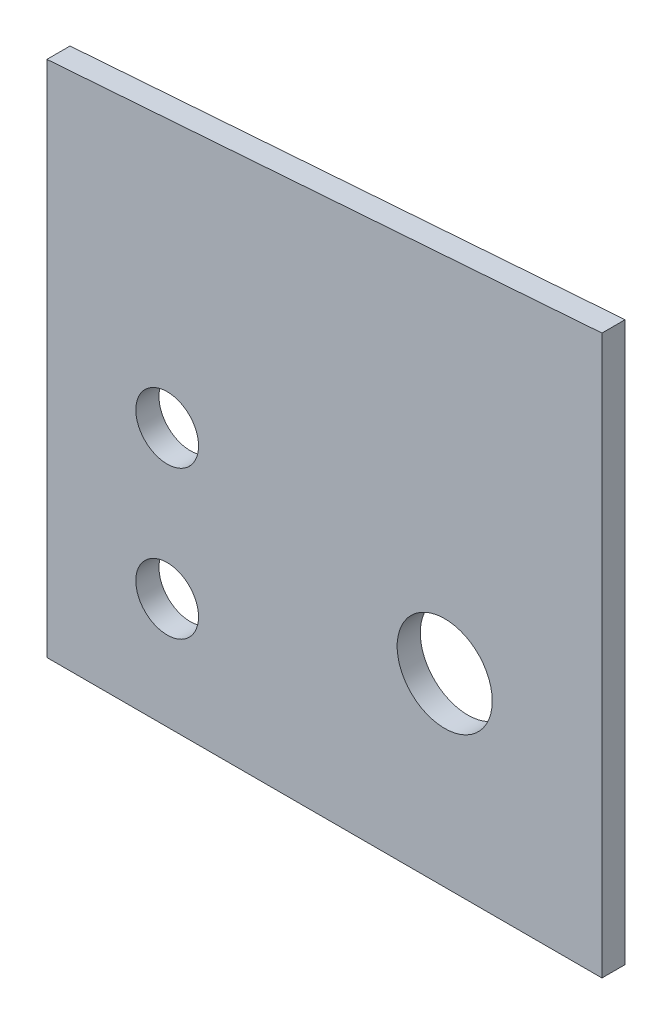
ISO-10303-21;
HEADER;
FILE_DESCRIPTION(('STEP AP214'),'2;1');
FILE_NAME('part.step','',(''),(''),'','','');
FILE_SCHEMA(('AUTOMOTIVE_DESIGN { 1 0 10303 214 1 1 1 1 }'));
ENDSEC;
DATA;
#1=APPLICATION_CONTEXT('core data for automotive mechanical design processes');
#2=APPLICATION_PROTOCOL_DEFINITION('international standard','automotive_design',2000,#1);
#3=PRODUCT_CONTEXT('',#1,'mechanical');
#4=PRODUCT('Part','Part','',(#3));
#5=PRODUCT_RELATED_PRODUCT_CATEGORY('part','',(#4));
#6=PRODUCT_DEFINITION_FORMATION('','',#4);
#7=PRODUCT_DEFINITION_CONTEXT('part definition',#1,'design');
#8=PRODUCT_DEFINITION('design','',#6,#7);
#9=PRODUCT_DEFINITION_SHAPE('','',#8);
#10=(LENGTH_UNIT() NAMED_UNIT(*) SI_UNIT(.MILLI.,.METRE.));
#11=(NAMED_UNIT(*) PLANE_ANGLE_UNIT() SI_UNIT($,.RADIAN.));
#12=(NAMED_UNIT(*) SI_UNIT($,.STERADIAN.) SOLID_ANGLE_UNIT());
#13=UNCERTAINTY_MEASURE_WITH_UNIT(LENGTH_MEASURE(1.E-05),#10,'distance_accuracy_value','');
#14=(GEOMETRIC_REPRESENTATION_CONTEXT(3) GLOBAL_UNCERTAINTY_ASSIGNED_CONTEXT((#13)) GLOBAL_UNIT_ASSIGNED_CONTEXT((#10,
#11,#12)) REPRESENTATION_CONTEXT('',''));
#15=CARTESIAN_POINT('',(0.,0.,0.));
#16=DIRECTION('',(0.,0.,1.));
#17=DIRECTION('',(1.,0.,0.));
#18=AXIS2_PLACEMENT_3D('',#15,#16,#17);
#19=CARTESIAN_POINT('',(0.,0.,1.5875));
#20=DIRECTION('',(0.,1.,0.));
#21=DIRECTION('',(0.,0.,1.));
#22=AXIS2_PLACEMENT_3D('',#19,#20,#21);
#23=PLANE('',#22);
#24=DIRECTION('',(1.,0.,0.));
#25=VECTOR('',#24,1.);
#26=CARTESIAN_POINT('',(0.,0.,0.));
#27=LINE('',#26,#25);
#28=CARTESIAN_POINT('',(0.,0.,0.));
#29=VERTEX_POINT('',#28);
#30=CARTESIAN_POINT('',(38.1,0.,0.));
#31=VERTEX_POINT('',#30);
#32=EDGE_CURVE('E117',#29,#31,#27,.T.);
#33=ORIENTED_EDGE('',*,*,#32,.T.);
#34=DIRECTION('',(0.,0.,-1.));
#35=VECTOR('',#34,1.);
#36=CARTESIAN_POINT('',(38.1,0.,1.5875));
#37=LINE('',#36,#35);
#38=CARTESIAN_POINT('',(38.1,0.,1.5875));
#39=VERTEX_POINT('',#38);
#40=EDGE_CURVE('E11',#39,#31,#37,.T.);
#41=ORIENTED_EDGE('',*,*,#40,.F.);
#42=DIRECTION('',(1.,0.,0.));
#43=VECTOR('',#42,1.);
#44=CARTESIAN_POINT('',(0.,0.,1.5875));
#45=LINE('',#44,#43);
#46=CARTESIAN_POINT('',(0.,0.,1.5875));
#47=VERTEX_POINT('',#46);
#48=EDGE_CURVE('E94',#47,#39,#45,.T.);
#49=ORIENTED_EDGE('',*,*,#48,.F.);
#50=DIRECTION('',(0.,0.,-1.));
#51=VECTOR('',#50,1.);
#52=CARTESIAN_POINT('',(0.,0.,1.5875));
#53=LINE('',#52,#51);
#54=EDGE_CURVE('E60',#47,#29,#53,.T.);
#55=ORIENTED_EDGE('',*,*,#54,.T.);
#56=EDGE_LOOP('',(#33,#41,#49,#55));
#57=FACE_BOUND('',#56,.T.);
#58=ADVANCED_FACE('F44',(#57),#23,.F.);
#59=CARTESIAN_POINT('',(38.1,0.,1.5875));
#60=DIRECTION('',(-1.,0.,0.));
#61=DIRECTION('',(0.,-1.,0.));
#62=AXIS2_PLACEMENT_3D('',#59,#60,#61);
#63=PLANE('',#62);
#64=DIRECTION('',(0.,1.,0.));
#65=VECTOR('',#64,1.);
#66=CARTESIAN_POINT('',(38.1,0.,0.));
#67=LINE('',#66,#65);
#68=CARTESIAN_POINT('',(38.1,38.3404376298724,0.));
#69=VERTEX_POINT('',#68);
#70=EDGE_CURVE('E99',#31,#69,#67,.T.);
#71=ORIENTED_EDGE('',*,*,#70,.T.);
#72=DIRECTION('',(0.,0.,-1.));
#73=VECTOR('',#72,1.);
#74=CARTESIAN_POINT('',(38.1,38.3404376298724,1.5875));
#75=LINE('',#74,#73);
#76=CARTESIAN_POINT('',(38.1,38.3404376298724,1.5875));
#77=VERTEX_POINT('',#76);
#78=EDGE_CURVE('E52',#77,#69,#75,.T.);
#79=ORIENTED_EDGE('',*,*,#78,.F.);
#80=DIRECTION('',(0.,1.,0.));
#81=VECTOR('',#80,1.);
#82=CARTESIAN_POINT('',(38.1,0.,1.5875));
#83=LINE('',#82,#81);
#84=EDGE_CURVE('E85',#39,#77,#83,.T.);
#85=ORIENTED_EDGE('',*,*,#84,.F.);
#86=ORIENTED_EDGE('',*,*,#40,.T.);
#87=EDGE_LOOP('',(#71,#79,#85,#86));
#88=FACE_BOUND('',#87,.T.);
#89=ADVANCED_FACE('F98',(#88),#63,.F.);
#90=CARTESIAN_POINT('',(-2.58132775459605,35.3716215006847,1.5875));
#91=DIRECTION('',(-0.0727838107538647,0.997347741207722,0.));
#92=DIRECTION('',(-0.997347741207722,-0.0727838107538647,0.));
#93=AXIS2_PLACEMENT_3D('',#90,#91,#92);
#94=PLANE('',#93);
#95=DIRECTION('',(0.997347741207722,0.0727838107538647,0.));
#96=VECTOR('',#95,1.);
#97=CARTESIAN_POINT('',(-2.58132775459605,35.3716215006847,0.));
#98=LINE('',#97,#96);
#99=CARTESIAN_POINT('',(0.,35.56,0.));
#100=VERTEX_POINT('',#99);
#101=EDGE_CURVE('E120',#100,#69,#98,.T.);
#102=ORIENTED_EDGE('',*,*,#101,.F.);
#103=DIRECTION('',(0.,0.,-1.));
#104=VECTOR('',#103,1.);
#105=CARTESIAN_POINT('',(0.,35.56,1.5875));
#106=LINE('',#105,#104);
#107=CARTESIAN_POINT('',(0.,35.56,1.5875));
#108=VERTEX_POINT('',#107);
#109=EDGE_CURVE('E74',#108,#100,#106,.T.);
#110=ORIENTED_EDGE('',*,*,#109,.F.);
#111=DIRECTION('',(0.997347741207722,0.0727838107538647,0.));
#112=VECTOR('',#111,1.);
#113=CARTESIAN_POINT('',(-2.58132775459605,35.3716215006847,1.5875));
#114=LINE('',#113,#112);
#115=EDGE_CURVE('E93',#108,#77,#114,.T.);
#116=ORIENTED_EDGE('',*,*,#115,.T.);
#117=ORIENTED_EDGE('',*,*,#78,.T.);
#118=EDGE_LOOP('',(#102,#110,#116,#117));
#119=FACE_BOUND('',#118,.T.);
#120=ADVANCED_FACE('F102',(#119),#94,.T.);
#121=CARTESIAN_POINT('',(8.255,7.62,1.5875));
#122=DIRECTION('',(0.,0.,-1.));
#123=DIRECTION('',(-1.,0.,0.));
#124=AXIS2_PLACEMENT_3D('',#121,#122,#123);
#125=CYLINDRICAL_SURFACE('',#124,2.15265);
#126=CARTESIAN_POINT('',(8.255,7.62,1.5875));
#127=DIRECTION('',(0.,0.,1.));
#128=DIRECTION('',(1.,0.,0.));
#129=AXIS2_PLACEMENT_3D('',#126,#127,#128);
#130=CIRCLE('',#129,2.15265);
#131=CARTESIAN_POINT('',(10.40765,7.62,1.5875));
#132=VERTEX_POINT('',#131);
#133=EDGE_CURVE('E111',#132,#132,#130,.T.);
#134=ORIENTED_EDGE('',*,*,#133,.T.);
#135=EDGE_LOOP('',(#134));
#136=FACE_BOUND('',#135,.T.);
#137=CARTESIAN_POINT('',(8.255,7.62,0.));
#138=DIRECTION('',(0.,0.,1.));
#139=DIRECTION('',(1.,0.,0.));
#140=AXIS2_PLACEMENT_3D('',#137,#138,#139);
#141=CIRCLE('',#140,2.15265);
#142=CARTESIAN_POINT('',(10.40765,7.62,0.));
#143=VERTEX_POINT('',#142);
#144=EDGE_CURVE('E128',#143,#143,#141,.T.);
#145=ORIENTED_EDGE('',*,*,#144,.F.);
#146=EDGE_LOOP('',(#145));
#147=FACE_BOUND('',#146,.T.);
#148=ADVANCED_FACE('F164',(#136,#147),#125,.F.);
#149=CARTESIAN_POINT('',(27.305,12.7,1.5875));
#150=DIRECTION('',(0.,0.,-1.));
#151=DIRECTION('',(-1.,0.,0.));
#152=AXIS2_PLACEMENT_3D('',#149,#150,#151);
#153=CYLINDRICAL_SURFACE('',#152,3.2639);
#154=CARTESIAN_POINT('',(27.305,12.7,1.5875));
#155=DIRECTION('',(0.,0.,1.));
#156=DIRECTION('',(1.,0.,0.));
#157=AXIS2_PLACEMENT_3D('',#154,#155,#156);
#158=CIRCLE('',#157,3.2639);
#159=CARTESIAN_POINT('',(30.5689,12.7,1.5875));
#160=VERTEX_POINT('',#159);
#161=EDGE_CURVE('E105',#160,#160,#158,.T.);
#162=ORIENTED_EDGE('',*,*,#161,.T.);
#163=EDGE_LOOP('',(#162));
#164=FACE_BOUND('',#163,.T.);
#165=CARTESIAN_POINT('',(27.305,12.7,0.));
#166=DIRECTION('',(0.,0.,1.));
#167=DIRECTION('',(1.,0.,0.));
#168=AXIS2_PLACEMENT_3D('',#165,#166,#167);
#169=CIRCLE('',#168,3.2639);
#170=CARTESIAN_POINT('',(30.5689,12.7,0.));
#171=VERTEX_POINT('',#170);
#172=EDGE_CURVE('E125',#171,#171,#169,.T.);
#173=ORIENTED_EDGE('',*,*,#172,.F.);
#174=EDGE_LOOP('',(#173));
#175=FACE_BOUND('',#174,.T.);
#176=ADVANCED_FACE('F149',(#164,#175),#153,.F.);
#177=CARTESIAN_POINT('',(0.,0.,1.5875));
#178=DIRECTION('',(-1.,0.,0.));
#179=DIRECTION('',(0.,-1.,0.));
#180=AXIS2_PLACEMENT_3D('',#177,#178,#179);
#181=PLANE('',#180);
#182=DIRECTION('',(0.,1.,0.));
#183=VECTOR('',#182,1.);
#184=CARTESIAN_POINT('',(0.,0.,0.));
#185=LINE('',#184,#183);
#186=EDGE_CURVE('E122',#29,#100,#185,.T.);
#187=ORIENTED_EDGE('',*,*,#186,.F.);
#188=ORIENTED_EDGE('',*,*,#54,.F.);
#189=DIRECTION('',(0.,1.,0.));
#190=VECTOR('',#189,1.);
#191=CARTESIAN_POINT('',(0.,0.,1.5875));
#192=LINE('',#191,#190);
#193=EDGE_CURVE('E103',#47,#108,#192,.T.);
#194=ORIENTED_EDGE('',*,*,#193,.T.);
#195=ORIENTED_EDGE('',*,*,#109,.T.);
#196=EDGE_LOOP('',(#187,#188,#194,#195));
#197=FACE_BOUND('',#196,.T.);
#198=ADVANCED_FACE('F141',(#197),#181,.T.);
#199=CARTESIAN_POINT('',(8.255,17.78,1.5875));
#200=DIRECTION('',(0.,0.,-1.));
#201=DIRECTION('',(-1.,0.,0.));
#202=AXIS2_PLACEMENT_3D('',#199,#200,#201);
#203=CYLINDRICAL_SURFACE('',#202,2.15265);
#204=CARTESIAN_POINT('',(8.255,17.78,1.5875));
#205=DIRECTION('',(0.,0.,1.));
#206=DIRECTION('',(1.,0.,0.));
#207=AXIS2_PLACEMENT_3D('',#204,#205,#206);
#208=CIRCLE('',#207,2.15265);
#209=CARTESIAN_POINT('',(10.40765,17.78,1.5875));
#210=VERTEX_POINT('',#209);
#211=EDGE_CURVE('E114',#210,#210,#208,.T.);
#212=ORIENTED_EDGE('',*,*,#211,.T.);
#213=EDGE_LOOP('',(#212));
#214=FACE_BOUND('',#213,.T.);
#215=CARTESIAN_POINT('',(8.255,17.78,0.));
#216=DIRECTION('',(0.,0.,1.));
#217=DIRECTION('',(1.,0.,0.));
#218=AXIS2_PLACEMENT_3D('',#215,#216,#217);
#219=CIRCLE('',#218,2.15265);
#220=CARTESIAN_POINT('',(10.40765,17.78,0.));
#221=VERTEX_POINT('',#220);
#222=EDGE_CURVE('E131',#221,#221,#219,.T.);
#223=ORIENTED_EDGE('',*,*,#222,.F.);
#224=EDGE_LOOP('',(#223));
#225=FACE_BOUND('',#224,.T.);
#226=ADVANCED_FACE('F139',(#214,#225),#203,.F.);
#227=CARTESIAN_POINT('',(0.,0.,1.5875));
#228=DIRECTION('',(0.,0.,1.));
#229=DIRECTION('',(1.,0.,0.));
#230=AXIS2_PLACEMENT_3D('',#227,#228,#229);
#231=PLANE('',#230);
#232=ORIENTED_EDGE('',*,*,#48,.T.);
#233=ORIENTED_EDGE('',*,*,#84,.T.);
#234=ORIENTED_EDGE('',*,*,#115,.F.);
#235=ORIENTED_EDGE('',*,*,#193,.F.);
#236=EDGE_LOOP('',(#232,#233,#234,#235));
#237=FACE_BOUND('',#236,.T.);
#238=ORIENTED_EDGE('',*,*,#161,.F.);
#239=EDGE_LOOP('',(#238));
#240=FACE_BOUND('',#239,.T.);
#241=ORIENTED_EDGE('',*,*,#133,.F.);
#242=EDGE_LOOP('',(#241));
#243=FACE_BOUND('',#242,.T.);
#244=ORIENTED_EDGE('',*,*,#211,.F.);
#245=EDGE_LOOP('',(#244));
#246=FACE_BOUND('',#245,.T.);
#247=ADVANCED_FACE('F89',(#237,#240,#243,#246),#231,.T.);
#248=CARTESIAN_POINT('',(0.,0.,0.));
#249=DIRECTION('',(0.,0.,1.));
#250=DIRECTION('',(1.,0.,0.));
#251=AXIS2_PLACEMENT_3D('',#248,#249,#250);
#252=PLANE('',#251);
#253=ORIENTED_EDGE('',*,*,#32,.F.);
#254=ORIENTED_EDGE('',*,*,#186,.T.);
#255=ORIENTED_EDGE('',*,*,#101,.T.);
#256=ORIENTED_EDGE('',*,*,#70,.F.);
#257=EDGE_LOOP('',(#253,#254,#255,#256));
#258=FACE_BOUND('',#257,.T.);
#259=ORIENTED_EDGE('',*,*,#172,.T.);
#260=EDGE_LOOP('',(#259));
#261=FACE_BOUND('',#260,.T.);
#262=ORIENTED_EDGE('',*,*,#144,.T.);
#263=EDGE_LOOP('',(#262));
#264=FACE_BOUND('',#263,.T.);
#265=ORIENTED_EDGE('',*,*,#222,.T.);
#266=EDGE_LOOP('',(#265));
#267=FACE_BOUND('',#266,.T.);
#268=ADVANCED_FACE('F137',(#258,#261,#264,#267),#252,.F.);
#269=CLOSED_SHELL('',(#58,#89,#120,#148,#176,#198,#226,#247,#268));
#270=MANIFOLD_SOLID_BREP('B2',#269);
#271=ADVANCED_BREP_SHAPE_REPRESENTATION('',(#18,#270),#14);
#272=SHAPE_DEFINITION_REPRESENTATION(#9,#271);
ENDSEC;
END-ISO-10303-21;
